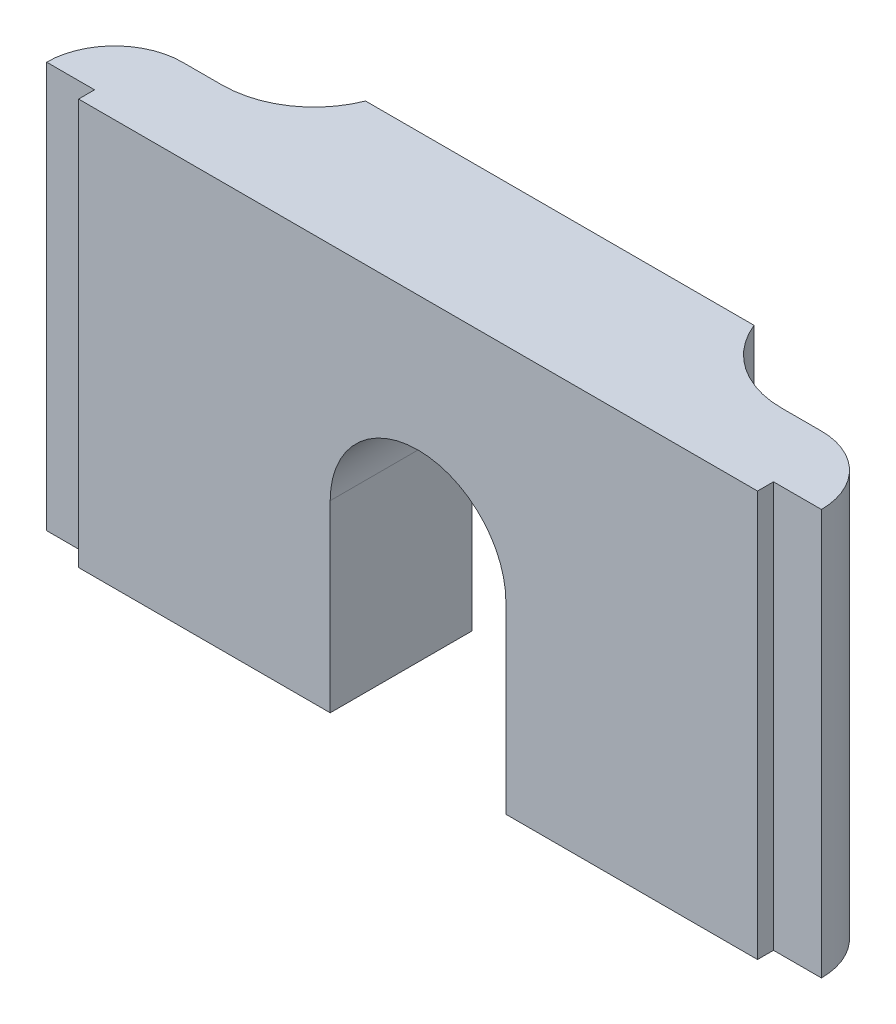
ISO-10303-21;
HEADER;
FILE_DESCRIPTION(('STEP AP214'),'2;1');
FILE_NAME('part.step','',(''),(''),'','','');
FILE_SCHEMA(('AUTOMOTIVE_DESIGN { 1 0 10303 214 1 1 1 1 }'));
ENDSEC;
DATA;
#1=APPLICATION_CONTEXT('core data for automotive mechanical design processes');
#2=APPLICATION_PROTOCOL_DEFINITION('international standard','automotive_design',2000,#1);
#3=PRODUCT_CONTEXT('',#1,'mechanical');
#4=PRODUCT('Part','Part','',(#3));
#5=PRODUCT_RELATED_PRODUCT_CATEGORY('part','',(#4));
#6=PRODUCT_DEFINITION_FORMATION('','',#4);
#7=PRODUCT_DEFINITION_CONTEXT('part definition',#1,'design');
#8=PRODUCT_DEFINITION('design','',#6,#7);
#9=PRODUCT_DEFINITION_SHAPE('','',#8);
#10=(LENGTH_UNIT() NAMED_UNIT(*) SI_UNIT(.MILLI.,.METRE.));
#11=(NAMED_UNIT(*) PLANE_ANGLE_UNIT() SI_UNIT($,.RADIAN.));
#12=(NAMED_UNIT(*) SI_UNIT($,.STERADIAN.) SOLID_ANGLE_UNIT());
#13=UNCERTAINTY_MEASURE_WITH_UNIT(LENGTH_MEASURE(1.E-05),#10,'distance_accuracy_value','');
#14=(GEOMETRIC_REPRESENTATION_CONTEXT(3) GLOBAL_UNCERTAINTY_ASSIGNED_CONTEXT((#13)) GLOBAL_UNIT_ASSIGNED_CONTEXT((#10,
#11,#12)) REPRESENTATION_CONTEXT('',''));
#15=CARTESIAN_POINT('',(0.,0.,0.));
#16=DIRECTION('',(0.,0.,1.));
#17=DIRECTION('',(1.,0.,0.));
#18=AXIS2_PLACEMENT_3D('',#15,#16,#17);
#19=CARTESIAN_POINT('',(35.0051226236648,0.,-4.24999885907502));
#20=DIRECTION('',(0.,1.,0.));
#21=DIRECTION('',(0.,0.,1.));
#22=AXIS2_PLACEMENT_3D('',#19,#20,#21);
#23=PLANE('',#22);
#24=DIRECTION('',(1.,0.,0.));
#25=VECTOR('',#24,1.);
#26=CARTESIAN_POINT('',(42.4999994295375,0.,17.7500005704625));
#27=LINE('',#26,#25);
#28=CARTESIAN_POINT('',(11.,0.,17.7500005704625));
#29=VERTEX_POINT('',#28);
#30=CARTESIAN_POINT('',(42.4999994295375,0.,17.7500005704625));
#31=VERTEX_POINT('',#30);
#32=EDGE_CURVE('E184',#29,#31,#27,.T.);
#33=ORIENTED_EDGE('',*,*,#32,.F.);
#34=DIRECTION('',(0.,0.,1.));
#35=VECTOR('',#34,1.);
#36=CARTESIAN_POINT('',(11.,0.,0.));
#37=LINE('',#36,#35);
#38=CARTESIAN_POINT('',(11.,0.,0.));
#39=VERTEX_POINT('',#38);
#40=EDGE_CURVE('E275',#39,#29,#37,.T.);
#41=ORIENTED_EDGE('',*,*,#40,.F.);
#42=DIRECTION('',(-1.,0.,0.));
#43=VECTOR('',#42,1.);
#44=CARTESIAN_POINT('',(-24.3192670333126,0.,0.));
#45=LINE('',#44,#43);
#46=CARTESIAN_POINT('',(24.3192670333126,0.,0.));
#47=VERTEX_POINT('',#46);
#48=EDGE_CURVE('E171',#47,#39,#45,.T.);
#49=ORIENTED_EDGE('',*,*,#48,.F.);
#50=CARTESIAN_POINT('',(35.0051226236648,0.,-4.24999885907502));
#51=DIRECTION('',(0.,-1.,0.));
#52=DIRECTION('',(0.,0.,1.));
#53=AXIS2_PLACEMENT_3D('',#50,#51,#52);
#54=CIRCLE('',#53,11.5);
#55=CARTESIAN_POINT('',(35.0051226236648,0.,7.25000114092498));
#56=VERTEX_POINT('',#55);
#57=EDGE_CURVE('E166',#56,#47,#54,.T.);
#58=ORIENTED_EDGE('',*,*,#57,.F.);
#59=DIRECTION('',(-1.,0.,0.));
#60=VECTOR('',#59,1.);
#61=CARTESIAN_POINT('',(35.0051226236648,0.,7.25000114092498));
#62=LINE('',#61,#60);
#63=CARTESIAN_POINT('',(40.,0.,7.25000114092498));
#64=VERTEX_POINT('',#63);
#65=EDGE_CURVE('E102',#64,#56,#62,.T.);
#66=ORIENTED_EDGE('',*,*,#65,.F.);
#67=CARTESIAN_POINT('',(40.,0.,15.7500005704625));
#68=DIRECTION('',(0.,1.,0.));
#69=DIRECTION('',(0.,0.,1.));
#70=AXIS2_PLACEMENT_3D('',#67,#68,#69);
#71=CIRCLE('',#70,8.49999942953751);
#72=CARTESIAN_POINT('',(48.4999994295375,0.,15.7500005704625));
#73=VERTEX_POINT('',#72);
#74=EDGE_CURVE('E191',#73,#64,#71,.T.);
#75=ORIENTED_EDGE('',*,*,#74,.F.);
#76=DIRECTION('',(1.,0.,0.));
#77=VECTOR('',#76,1.);
#78=CARTESIAN_POINT('',(48.4999994295375,0.,15.7500005704625));
#79=LINE('',#78,#77);
#80=CARTESIAN_POINT('',(42.4999994295375,0.,15.7500005704625));
#81=VERTEX_POINT('',#80);
#82=EDGE_CURVE('E154',#81,#73,#79,.T.);
#83=ORIENTED_EDGE('',*,*,#82,.F.);
#84=DIRECTION('',(0.,0.,-1.));
#85=VECTOR('',#84,1.);
#86=CARTESIAN_POINT('',(42.4999994295375,0.,15.7500005704625));
#87=LINE('',#86,#85);
#88=EDGE_CURVE('E188',#31,#81,#87,.T.);
#89=ORIENTED_EDGE('',*,*,#88,.F.);
#90=EDGE_LOOP('',(#33,#41,#49,#58,#66,#75,#83,#89));
#91=FACE_BOUND('',#90,.T.);
#92=ADVANCED_FACE('F33',(#91),#23,.F.);
#93=CARTESIAN_POINT('',(35.0051226236648,50.8,-4.24999885907502));
#94=DIRECTION('',(0.,-1.,0.));
#95=DIRECTION('',(0.,0.,-1.));
#96=AXIS2_PLACEMENT_3D('',#93,#94,#95);
#97=CYLINDRICAL_SURFACE('',#96,11.5);
#98=ORIENTED_EDGE('',*,*,#57,.T.);
#99=DIRECTION('',(0.,-1.,0.));
#100=VECTOR('',#99,1.);
#101=CARTESIAN_POINT('',(24.3192670333126,50.8,0.));
#102=LINE('',#101,#100);
#103=CARTESIAN_POINT('',(24.3192670333126,50.8,0.));
#104=VERTEX_POINT('',#103);
#105=EDGE_CURVE('E11',#104,#47,#102,.T.);
#106=ORIENTED_EDGE('',*,*,#105,.F.);
#107=CARTESIAN_POINT('',(35.0051226236648,50.8,-4.24999885907502));
#108=DIRECTION('',(0.,-1.,0.));
#109=DIRECTION('',(0.,0.,1.));
#110=AXIS2_PLACEMENT_3D('',#107,#108,#109);
#111=CIRCLE('',#110,11.5);
#112=CARTESIAN_POINT('',(35.0051226236648,50.8,7.25000114092498));
#113=VERTEX_POINT('',#112);
#114=EDGE_CURVE('E194',#113,#104,#111,.T.);
#115=ORIENTED_EDGE('',*,*,#114,.F.);
#116=DIRECTION('',(0.,-1.,0.));
#117=VECTOR('',#116,1.);
#118=CARTESIAN_POINT('',(35.0051226236648,50.8,7.25000114092498));
#119=LINE('',#118,#117);
#120=EDGE_CURVE('E162',#113,#56,#119,.T.);
#121=ORIENTED_EDGE('',*,*,#120,.T.);
#122=EDGE_LOOP('',(#98,#106,#115,#121));
#123=FACE_BOUND('',#122,.T.);
#124=ADVANCED_FACE('F35',(#123),#97,.F.);
#125=CARTESIAN_POINT('',(-24.3192670333126,50.8,0.));
#126=DIRECTION('',(0.,0.,1.));
#127=DIRECTION('',(1.,0.,0.));
#128=AXIS2_PLACEMENT_3D('',#125,#126,#127);
#129=PLANE('',#128);
#130=ORIENTED_EDGE('',*,*,#48,.T.);
#131=DIRECTION('',(0.,1.,0.));
#132=VECTOR('',#131,1.);
#133=CARTESIAN_POINT('',(11.,0.,0.));
#134=LINE('',#133,#132);
#135=CARTESIAN_POINT('',(11.,23.,0.));
#136=VERTEX_POINT('',#135);
#137=EDGE_CURVE('E273',#39,#136,#134,.T.);
#138=ORIENTED_EDGE('',*,*,#137,.T.);
#139=CARTESIAN_POINT('',(0.,23.,0.));
#140=DIRECTION('',(0.,0.,1.));
#141=DIRECTION('',(1.,0.,0.));
#142=AXIS2_PLACEMENT_3D('',#139,#140,#141);
#143=CIRCLE('',#142,11.);
#144=CARTESIAN_POINT('',(-11.,23.,0.));
#145=VERTEX_POINT('',#144);
#146=EDGE_CURVE('E283',#136,#145,#143,.T.);
#147=ORIENTED_EDGE('',*,*,#146,.T.);
#148=DIRECTION('',(0.,-1.,0.));
#149=VECTOR('',#148,1.);
#150=CARTESIAN_POINT('',(-11.,23.,0.));
#151=LINE('',#150,#149);
#152=CARTESIAN_POINT('',(-11.,0.,0.));
#153=VERTEX_POINT('',#152);
#154=EDGE_CURVE('E290',#145,#153,#151,.T.);
#155=ORIENTED_EDGE('',*,*,#154,.T.);
#156=CARTESIAN_POINT('',(-24.3192670333126,0.,0.));
#157=VERTEX_POINT('',#156);
#158=EDGE_CURVE('E169',#153,#157,#45,.T.);
#159=ORIENTED_EDGE('',*,*,#158,.T.);
#160=DIRECTION('',(0.,-1.,0.));
#161=VECTOR('',#160,1.);
#162=CARTESIAN_POINT('',(-24.3192670333126,50.8,0.));
#163=LINE('',#162,#161);
#164=CARTESIAN_POINT('',(-24.3192670333126,50.8,0.));
#165=VERTEX_POINT('',#164);
#166=EDGE_CURVE('E41',#165,#157,#163,.T.);
#167=ORIENTED_EDGE('',*,*,#166,.F.);
#168=DIRECTION('',(-1.,0.,0.));
#169=VECTOR('',#168,1.);
#170=CARTESIAN_POINT('',(-24.3192670333126,50.8,0.));
#171=LINE('',#170,#169);
#172=EDGE_CURVE('E110',#104,#165,#171,.T.);
#173=ORIENTED_EDGE('',*,*,#172,.F.);
#174=ORIENTED_EDGE('',*,*,#105,.T.);
#175=EDGE_LOOP('',(#130,#138,#147,#155,#159,#167,#173,#174));
#176=FACE_BOUND('',#175,.T.);
#177=ADVANCED_FACE('F296',(#176),#129,.F.);
#178=CARTESIAN_POINT('',(-35.0051226236648,50.8,-4.24999885907502));
#179=DIRECTION('',(0.,-1.,0.));
#180=DIRECTION('',(0.,0.,-1.));
#181=AXIS2_PLACEMENT_3D('',#178,#179,#180);
#182=CYLINDRICAL_SURFACE('',#181,11.5);
#183=CARTESIAN_POINT('',(-35.0051226236648,0.,-4.24999885907502));
#184=DIRECTION('',(0.,-1.,0.));
#185=DIRECTION('',(0.,0.,-1.));
#186=AXIS2_PLACEMENT_3D('',#183,#184,#185);
#187=CIRCLE('',#186,11.5);
#188=CARTESIAN_POINT('',(-35.0051226236648,0.,7.25000114092498));
#189=VERTEX_POINT('',#188);
#190=EDGE_CURVE('E174',#157,#189,#187,.T.);
#191=ORIENTED_EDGE('',*,*,#190,.T.);
#192=DIRECTION('',(0.,-1.,0.));
#193=VECTOR('',#192,1.);
#194=CARTESIAN_POINT('',(-35.0051226236648,50.8,7.25000114092498));
#195=LINE('',#194,#193);
#196=CARTESIAN_POINT('',(-35.0051226236648,50.8,7.25000114092498));
#197=VERTEX_POINT('',#196);
#198=EDGE_CURVE('E213',#197,#189,#195,.T.);
#199=ORIENTED_EDGE('',*,*,#198,.F.);
#200=CARTESIAN_POINT('',(-35.0051226236648,50.8,-4.24999885907502));
#201=DIRECTION('',(0.,-1.,0.));
#202=DIRECTION('',(0.,0.,-1.));
#203=AXIS2_PLACEMENT_3D('',#200,#201,#202);
#204=CIRCLE('',#203,11.5);
#205=EDGE_CURVE('E221',#165,#197,#204,.T.);
#206=ORIENTED_EDGE('',*,*,#205,.F.);
#207=ORIENTED_EDGE('',*,*,#166,.T.);
#208=EDGE_LOOP('',(#191,#199,#206,#207));
#209=FACE_BOUND('',#208,.T.);
#210=ADVANCED_FACE('F219',(#209),#182,.F.);
#211=CARTESIAN_POINT('',(-35.0051226236648,50.8,7.25000114092498));
#212=DIRECTION('',(0.,0.,1.));
#213=DIRECTION('',(1.,0.,0.));
#214=AXIS2_PLACEMENT_3D('',#211,#212,#213);
#215=PLANE('',#214);
#216=DIRECTION('',(-1.,0.,0.));
#217=VECTOR('',#216,1.);
#218=CARTESIAN_POINT('',(-35.0051226236648,0.,7.25000114092498));
#219=LINE('',#218,#217);
#220=CARTESIAN_POINT('',(-40.,0.,7.25000114092498));
#221=VERTEX_POINT('',#220);
#222=EDGE_CURVE('E176',#189,#221,#219,.T.);
#223=ORIENTED_EDGE('',*,*,#222,.T.);
#224=DIRECTION('',(0.,-1.,0.));
#225=VECTOR('',#224,1.);
#226=CARTESIAN_POINT('',(-40.,50.8,7.25000114092498));
#227=LINE('',#226,#225);
#228=CARTESIAN_POINT('',(-40.,50.8,7.25000114092498));
#229=VERTEX_POINT('',#228);
#230=EDGE_CURVE('E210',#229,#221,#227,.T.);
#231=ORIENTED_EDGE('',*,*,#230,.F.);
#232=DIRECTION('',(-1.,0.,0.));
#233=VECTOR('',#232,1.);
#234=CARTESIAN_POINT('',(-35.0051226236648,50.8,7.25000114092498));
#235=LINE('',#234,#233);
#236=EDGE_CURVE('E240',#197,#229,#235,.T.);
#237=ORIENTED_EDGE('',*,*,#236,.F.);
#238=ORIENTED_EDGE('',*,*,#198,.T.);
#239=EDGE_LOOP('',(#223,#231,#237,#238));
#240=FACE_BOUND('',#239,.T.);
#241=ADVANCED_FACE('F231',(#240),#215,.F.);
#242=CARTESIAN_POINT('',(-40.,50.8,15.7500005704625));
#243=DIRECTION('',(0.,-1.,0.));
#244=DIRECTION('',(0.,0.,-1.));
#245=AXIS2_PLACEMENT_3D('',#242,#243,#244);
#246=CYLINDRICAL_SURFACE('',#245,8.49999942953751);
#247=CARTESIAN_POINT('',(-40.,0.,15.7500005704625));
#248=DIRECTION('',(0.,1.,0.));
#249=DIRECTION('',(0.,0.,-1.));
#250=AXIS2_PLACEMENT_3D('',#247,#248,#249);
#251=CIRCLE('',#250,8.49999942953751);
#252=CARTESIAN_POINT('',(-48.4999994295375,0.,15.7500005704625));
#253=VERTEX_POINT('',#252);
#254=EDGE_CURVE('E178',#221,#253,#251,.T.);
#255=ORIENTED_EDGE('',*,*,#254,.T.);
#256=DIRECTION('',(0.,-1.,0.));
#257=VECTOR('',#256,1.);
#258=CARTESIAN_POINT('',(-48.4999994295375,50.8,15.7500005704625));
#259=LINE('',#258,#257);
#260=CARTESIAN_POINT('',(-48.4999994295375,50.8,15.7500005704625));
#261=VERTEX_POINT('',#260);
#262=EDGE_CURVE('E207',#261,#253,#259,.T.);
#263=ORIENTED_EDGE('',*,*,#262,.F.);
#264=CARTESIAN_POINT('',(-40.,50.8,15.7500005704625));
#265=DIRECTION('',(0.,1.,0.));
#266=DIRECTION('',(0.,0.,-1.));
#267=AXIS2_PLACEMENT_3D('',#264,#265,#266);
#268=CIRCLE('',#267,8.49999942953751);
#269=EDGE_CURVE('E237',#229,#261,#268,.T.);
#270=ORIENTED_EDGE('',*,*,#269,.F.);
#271=ORIENTED_EDGE('',*,*,#230,.T.);
#272=EDGE_LOOP('',(#255,#263,#270,#271));
#273=FACE_BOUND('',#272,.T.);
#274=ADVANCED_FACE('F235',(#273),#246,.T.);
#275=CARTESIAN_POINT('',(-48.4999994295375,50.8,15.7500005704625));
#276=DIRECTION('',(0.,0.,-1.));
#277=DIRECTION('',(-1.,0.,0.));
#278=AXIS2_PLACEMENT_3D('',#275,#276,#277);
#279=PLANE('',#278);
#280=DIRECTION('',(1.,0.,0.));
#281=VECTOR('',#280,1.);
#282=CARTESIAN_POINT('',(-48.4999994295375,0.,15.7500005704625));
#283=LINE('',#282,#281);
#284=CARTESIAN_POINT('',(-42.4999994295375,0.,15.7500005704625));
#285=VERTEX_POINT('',#284);
#286=EDGE_CURVE('E180',#253,#285,#283,.T.);
#287=ORIENTED_EDGE('',*,*,#286,.T.);
#288=DIRECTION('',(0.,-1.,0.));
#289=VECTOR('',#288,1.);
#290=CARTESIAN_POINT('',(-42.4999994295375,50.8,15.7500005704625));
#291=LINE('',#290,#289);
#292=CARTESIAN_POINT('',(-42.4999994295375,50.8,15.7500005704625));
#293=VERTEX_POINT('',#292);
#294=EDGE_CURVE('E204',#293,#285,#291,.T.);
#295=ORIENTED_EDGE('',*,*,#294,.F.);
#296=DIRECTION('',(1.,0.,0.));
#297=VECTOR('',#296,1.);
#298=CARTESIAN_POINT('',(-48.4999994295375,50.8,15.7500005704625));
#299=LINE('',#298,#297);
#300=EDGE_CURVE('E239',#261,#293,#299,.T.);
#301=ORIENTED_EDGE('',*,*,#300,.F.);
#302=ORIENTED_EDGE('',*,*,#262,.T.);
#303=EDGE_LOOP('',(#287,#295,#301,#302));
#304=FACE_BOUND('',#303,.T.);
#305=ADVANCED_FACE('F353',(#304),#279,.F.);
#306=CARTESIAN_POINT('',(-42.4999994295375,50.8,15.7500005704625));
#307=DIRECTION('',(1.,0.,0.));
#308=DIRECTION('',(0.,0.,-1.));
#309=AXIS2_PLACEMENT_3D('',#306,#307,#308);
#310=PLANE('',#309);
#311=DIRECTION('',(0.,0.,1.));
#312=VECTOR('',#311,1.);
#313=CARTESIAN_POINT('',(-42.4999994295375,0.,15.7500005704625));
#314=LINE('',#313,#312);
#315=CARTESIAN_POINT('',(-42.4999994295375,0.,17.7500005704625));
#316=VERTEX_POINT('',#315);
#317=EDGE_CURVE('E182',#285,#316,#314,.T.);
#318=ORIENTED_EDGE('',*,*,#317,.T.);
#319=DIRECTION('',(0.,-1.,0.));
#320=VECTOR('',#319,1.);
#321=CARTESIAN_POINT('',(-42.4999994295375,50.8,17.7500005704625));
#322=LINE('',#321,#320);
#323=CARTESIAN_POINT('',(-42.4999994295375,50.8,17.7500005704625));
#324=VERTEX_POINT('',#323);
#325=EDGE_CURVE('E201',#324,#316,#322,.T.);
#326=ORIENTED_EDGE('',*,*,#325,.F.);
#327=DIRECTION('',(0.,0.,1.));
#328=VECTOR('',#327,1.);
#329=CARTESIAN_POINT('',(-42.4999994295375,50.8,15.7500005704625));
#330=LINE('',#329,#328);
#331=EDGE_CURVE('E242',#293,#324,#330,.T.);
#332=ORIENTED_EDGE('',*,*,#331,.F.);
#333=ORIENTED_EDGE('',*,*,#294,.T.);
#334=EDGE_LOOP('',(#318,#326,#332,#333));
#335=FACE_BOUND('',#334,.T.);
#336=ADVANCED_FACE('F350',(#335),#310,.F.);
#337=CARTESIAN_POINT('',(42.4999994295375,50.8,17.7500005704625));
#338=DIRECTION('',(0.,0.,-1.));
#339=DIRECTION('',(-1.,0.,0.));
#340=AXIS2_PLACEMENT_3D('',#337,#338,#339);
#341=PLANE('',#340);
#342=CARTESIAN_POINT('',(0.,23.,17.7500005704625));
#343=DIRECTION('',(0.,0.,1.));
#344=DIRECTION('',(1.,0.,0.));
#345=AXIS2_PLACEMENT_3D('',#342,#343,#344);
#346=CIRCLE('',#345,11.);
#347=CARTESIAN_POINT('',(11.,23.,17.7500005704625));
#348=VERTEX_POINT('',#347);
#349=CARTESIAN_POINT('',(-11.,23.,17.7500005704625));
#350=VERTEX_POINT('',#349);
#351=EDGE_CURVE('E285',#348,#350,#346,.T.);
#352=ORIENTED_EDGE('',*,*,#351,.F.);
#353=DIRECTION('',(0.,1.,0.));
#354=VECTOR('',#353,1.);
#355=CARTESIAN_POINT('',(11.,0.,17.7500005704625));
#356=LINE('',#355,#354);
#357=EDGE_CURVE('E280',#29,#348,#356,.T.);
#358=ORIENTED_EDGE('',*,*,#357,.F.);
#359=ORIENTED_EDGE('',*,*,#32,.T.);
#360=DIRECTION('',(0.,-1.,0.));
#361=VECTOR('',#360,1.);
#362=CARTESIAN_POINT('',(42.4999994295375,50.8,17.7500005704625));
#363=LINE('',#362,#361);
#364=CARTESIAN_POINT('',(42.4999994295375,50.8,17.7500005704625));
#365=VERTEX_POINT('',#364);
#366=EDGE_CURVE('E198',#365,#31,#363,.T.);
#367=ORIENTED_EDGE('',*,*,#366,.F.);
#368=DIRECTION('',(1.,0.,0.));
#369=VECTOR('',#368,1.);
#370=CARTESIAN_POINT('',(42.4999994295375,50.8,17.7500005704625));
#371=LINE('',#370,#369);
#372=EDGE_CURVE('E248',#324,#365,#371,.T.);
#373=ORIENTED_EDGE('',*,*,#372,.F.);
#374=ORIENTED_EDGE('',*,*,#325,.T.);
#375=CARTESIAN_POINT('',(-11.,0.,17.7500005704625));
#376=VERTEX_POINT('',#375);
#377=EDGE_CURVE('E185',#316,#376,#27,.T.);
#378=ORIENTED_EDGE('',*,*,#377,.T.);
#379=DIRECTION('',(0.,-1.,0.));
#380=VECTOR('',#379,1.);
#381=CARTESIAN_POINT('',(-11.,23.,17.7500005704625));
#382=LINE('',#381,#380);
#383=EDGE_CURVE('E48',#350,#376,#382,.T.);
#384=ORIENTED_EDGE('',*,*,#383,.F.);
#385=EDGE_LOOP('',(#352,#358,#359,#367,#373,#374,#378,#384));
#386=FACE_BOUND('',#385,.T.);
#387=ADVANCED_FACE('F255',(#386),#341,.F.);
#388=CARTESIAN_POINT('',(42.4999994295375,50.8,15.7500005704625));
#389=DIRECTION('',(-1.,0.,0.));
#390=DIRECTION('',(0.,0.,1.));
#391=AXIS2_PLACEMENT_3D('',#388,#389,#390);
#392=PLANE('',#391);
#393=ORIENTED_EDGE('',*,*,#88,.T.);
#394=DIRECTION('',(0.,-1.,0.));
#395=VECTOR('',#394,1.);
#396=CARTESIAN_POINT('',(42.4999994295375,50.8,15.7500005704625));
#397=LINE('',#396,#395);
#398=CARTESIAN_POINT('',(42.4999994295375,50.8,15.7500005704625));
#399=VERTEX_POINT('',#398);
#400=EDGE_CURVE('E157',#399,#81,#397,.T.);
#401=ORIENTED_EDGE('',*,*,#400,.F.);
#402=DIRECTION('',(0.,0.,-1.));
#403=VECTOR('',#402,1.);
#404=CARTESIAN_POINT('',(42.4999994295375,50.8,15.7500005704625));
#405=LINE('',#404,#403);
#406=EDGE_CURVE('E145',#365,#399,#405,.T.);
#407=ORIENTED_EDGE('',*,*,#406,.F.);
#408=ORIENTED_EDGE('',*,*,#366,.T.);
#409=EDGE_LOOP('',(#393,#401,#407,#408));
#410=FACE_BOUND('',#409,.T.);
#411=ADVANCED_FACE('F260',(#410),#392,.F.);
#412=CARTESIAN_POINT('',(48.4999994295375,50.8,15.7500005704625));
#413=DIRECTION('',(0.,0.,-1.));
#414=DIRECTION('',(-1.,0.,0.));
#415=AXIS2_PLACEMENT_3D('',#412,#413,#414);
#416=PLANE('',#415);
#417=ORIENTED_EDGE('',*,*,#82,.T.);
#418=DIRECTION('',(0.,-1.,0.));
#419=VECTOR('',#418,1.);
#420=CARTESIAN_POINT('',(48.4999994295375,50.8,15.7500005704625));
#421=LINE('',#420,#419);
#422=CARTESIAN_POINT('',(48.4999994295375,50.8,15.7500005704625));
#423=VERTEX_POINT('',#422);
#424=EDGE_CURVE('E151',#423,#73,#421,.T.);
#425=ORIENTED_EDGE('',*,*,#424,.F.);
#426=DIRECTION('',(1.,0.,0.));
#427=VECTOR('',#426,1.);
#428=CARTESIAN_POINT('',(48.4999994295375,50.8,15.7500005704625));
#429=LINE('',#428,#427);
#430=EDGE_CURVE('E138',#399,#423,#429,.T.);
#431=ORIENTED_EDGE('',*,*,#430,.F.);
#432=ORIENTED_EDGE('',*,*,#400,.T.);
#433=EDGE_LOOP('',(#417,#425,#431,#432));
#434=FACE_BOUND('',#433,.T.);
#435=ADVANCED_FACE('F152',(#434),#416,.F.);
#436=CARTESIAN_POINT('',(40.,50.8,15.7500005704625));
#437=DIRECTION('',(0.,-1.,0.));
#438=DIRECTION('',(0.,0.,-1.));
#439=AXIS2_PLACEMENT_3D('',#436,#437,#438);
#440=CYLINDRICAL_SURFACE('',#439,8.49999942953751);
#441=ORIENTED_EDGE('',*,*,#74,.T.);
#442=DIRECTION('',(0.,-1.,0.));
#443=VECTOR('',#442,1.);
#444=CARTESIAN_POINT('',(40.,50.8,7.25000114092498));
#445=LINE('',#444,#443);
#446=CARTESIAN_POINT('',(40.,50.8,7.25000114092498));
#447=VERTEX_POINT('',#446);
#448=EDGE_CURVE('E158',#447,#64,#445,.T.);
#449=ORIENTED_EDGE('',*,*,#448,.F.);
#450=CARTESIAN_POINT('',(40.,50.8,15.7500005704625));
#451=DIRECTION('',(0.,1.,0.));
#452=DIRECTION('',(0.,0.,1.));
#453=AXIS2_PLACEMENT_3D('',#450,#451,#452);
#454=CIRCLE('',#453,8.49999942953751);
#455=EDGE_CURVE('E142',#423,#447,#454,.T.);
#456=ORIENTED_EDGE('',*,*,#455,.F.);
#457=ORIENTED_EDGE('',*,*,#424,.T.);
#458=EDGE_LOOP('',(#441,#449,#456,#457));
#459=FACE_BOUND('',#458,.T.);
#460=ADVANCED_FACE('F160',(#459),#440,.T.);
#461=CARTESIAN_POINT('',(35.0051226236648,50.8,7.25000114092498));
#462=DIRECTION('',(0.,0.,1.));
#463=DIRECTION('',(1.,0.,0.));
#464=AXIS2_PLACEMENT_3D('',#461,#462,#463);
#465=PLANE('',#464);
#466=ORIENTED_EDGE('',*,*,#65,.T.);
#467=ORIENTED_EDGE('',*,*,#120,.F.);
#468=DIRECTION('',(-1.,0.,0.));
#469=VECTOR('',#468,1.);
#470=CARTESIAN_POINT('',(35.0051226236648,50.8,7.25000114092498));
#471=LINE('',#470,#469);
#472=EDGE_CURVE('E57',#447,#113,#471,.T.);
#473=ORIENTED_EDGE('',*,*,#472,.F.);
#474=ORIENTED_EDGE('',*,*,#448,.T.);
#475=EDGE_LOOP('',(#466,#467,#473,#474));
#476=FACE_BOUND('',#475,.T.);
#477=ADVANCED_FACE('F263',(#476),#465,.F.);
#478=CARTESIAN_POINT('',(35.0051226236648,50.8,-4.24999885907502));
#479=DIRECTION('',(0.,1.,0.));
#480=DIRECTION('',(0.,0.,1.));
#481=AXIS2_PLACEMENT_3D('',#478,#479,#480);
#482=PLANE('',#481);
#483=ORIENTED_EDGE('',*,*,#114,.T.);
#484=ORIENTED_EDGE('',*,*,#172,.T.);
#485=ORIENTED_EDGE('',*,*,#205,.T.);
#486=ORIENTED_EDGE('',*,*,#236,.T.);
#487=ORIENTED_EDGE('',*,*,#269,.T.);
#488=ORIENTED_EDGE('',*,*,#300,.T.);
#489=ORIENTED_EDGE('',*,*,#331,.T.);
#490=ORIENTED_EDGE('',*,*,#372,.T.);
#491=ORIENTED_EDGE('',*,*,#406,.T.);
#492=ORIENTED_EDGE('',*,*,#430,.T.);
#493=ORIENTED_EDGE('',*,*,#455,.T.);
#494=ORIENTED_EDGE('',*,*,#472,.T.);
#495=EDGE_LOOP('',(#483,#484,#485,#486,#487,#488,#489,#490,#491,#492,#493,#494));
#496=FACE_BOUND('',#495,.T.);
#497=ADVANCED_FACE('F140',(#496),#482,.T.);
#498=ORIENTED_EDGE('',*,*,#158,.F.);
#499=DIRECTION('',(0.,0.,1.));
#500=VECTOR('',#499,1.);
#501=CARTESIAN_POINT('',(-11.,0.,0.));
#502=LINE('',#501,#500);
#503=EDGE_CURVE('E272',#153,#376,#502,.T.);
#504=ORIENTED_EDGE('',*,*,#503,.T.);
#505=ORIENTED_EDGE('',*,*,#377,.F.);
#506=ORIENTED_EDGE('',*,*,#317,.F.);
#507=ORIENTED_EDGE('',*,*,#286,.F.);
#508=ORIENTED_EDGE('',*,*,#254,.F.);
#509=ORIENTED_EDGE('',*,*,#222,.F.);
#510=ORIENTED_EDGE('',*,*,#190,.F.);
#511=EDGE_LOOP('',(#498,#504,#505,#506,#507,#508,#509,#510));
#512=FACE_BOUND('',#511,.T.);
#513=ADVANCED_FACE('F225',(#512),#23,.F.);
#514=CARTESIAN_POINT('',(0.,23.,0.));
#515=DIRECTION('',(0.,0.,1.));
#516=DIRECTION('',(1.,0.,0.));
#517=AXIS2_PLACEMENT_3D('',#514,#515,#516);
#518=CYLINDRICAL_SURFACE('',#517,11.);
#519=ORIENTED_EDGE('',*,*,#351,.T.);
#520=DIRECTION('',(0.,0.,1.));
#521=VECTOR('',#520,1.);
#522=CARTESIAN_POINT('',(-11.,23.,0.));
#523=LINE('',#522,#521);
#524=EDGE_CURVE('E270',#145,#350,#523,.T.);
#525=ORIENTED_EDGE('',*,*,#524,.F.);
#526=ORIENTED_EDGE('',*,*,#146,.F.);
#527=DIRECTION('',(0.,0.,1.));
#528=VECTOR('',#527,1.);
#529=CARTESIAN_POINT('',(11.,23.,0.));
#530=LINE('',#529,#528);
#531=EDGE_CURVE('E170',#136,#348,#530,.T.);
#532=ORIENTED_EDGE('',*,*,#531,.T.);
#533=EDGE_LOOP('',(#519,#525,#526,#532));
#534=FACE_BOUND('',#533,.T.);
#535=ADVANCED_FACE('F302',(#534),#518,.F.);
#536=CARTESIAN_POINT('',(11.,0.,0.));
#537=DIRECTION('',(1.,0.,0.));
#538=DIRECTION('',(0.,1.,0.));
#539=AXIS2_PLACEMENT_3D('',#536,#537,#538);
#540=PLANE('',#539);
#541=ORIENTED_EDGE('',*,*,#357,.T.);
#542=ORIENTED_EDGE('',*,*,#531,.F.);
#543=ORIENTED_EDGE('',*,*,#137,.F.);
#544=ORIENTED_EDGE('',*,*,#40,.T.);
#545=EDGE_LOOP('',(#541,#542,#543,#544));
#546=FACE_BOUND('',#545,.T.);
#547=ADVANCED_FACE('F313',(#546),#540,.F.);
#548=CARTESIAN_POINT('',(-11.,23.,0.));
#549=DIRECTION('',(-1.,0.,0.));
#550=DIRECTION('',(0.,-1.,0.));
#551=AXIS2_PLACEMENT_3D('',#548,#549,#550);
#552=PLANE('',#551);
#553=ORIENTED_EDGE('',*,*,#383,.T.);
#554=ORIENTED_EDGE('',*,*,#503,.F.);
#555=ORIENTED_EDGE('',*,*,#154,.F.);
#556=ORIENTED_EDGE('',*,*,#524,.T.);
#557=EDGE_LOOP('',(#553,#554,#555,#556));
#558=FACE_BOUND('',#557,.T.);
#559=ADVANCED_FACE('F316',(#558),#552,.F.);
#560=CLOSED_SHELL('',(#92,#124,#177,#210,#241,#274,#305,#336,#387,#411,#435,#460,#477,#497,#513,
#535,#547,#559));
#561=MANIFOLD_SOLID_BREP('B2',#560);
#562=ADVANCED_BREP_SHAPE_REPRESENTATION('',(#18,#561),#14);
#563=SHAPE_DEFINITION_REPRESENTATION(#9,#562);
ENDSEC;
END-ISO-10303-21;
